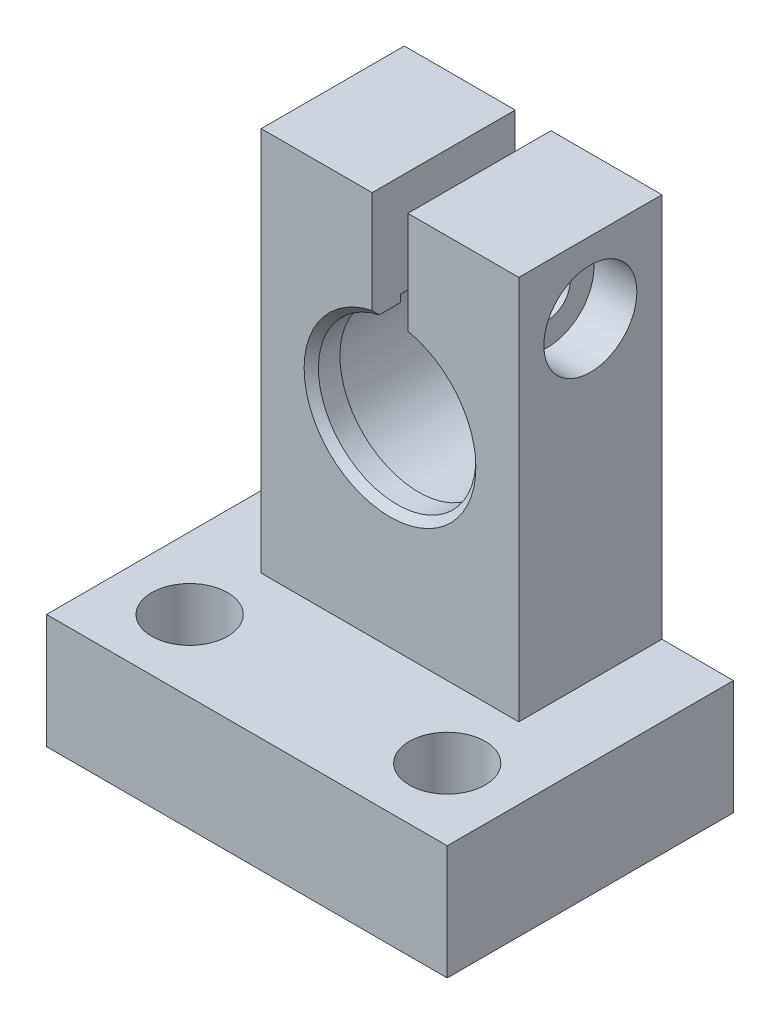
ISO-10303-21;
HEADER;
FILE_DESCRIPTION(('STEP AP214'),'2;1');
FILE_NAME('part.step','',(''),(''),'','','');
FILE_SCHEMA(('AUTOMOTIVE_DESIGN { 1 0 10303 214 1 1 1 1 }'));
ENDSEC;
DATA;
#1=APPLICATION_CONTEXT('core data for automotive mechanical design processes');
#2=APPLICATION_PROTOCOL_DEFINITION('international standard','automotive_design',2000,#1);
#3=PRODUCT_CONTEXT('',#1,'mechanical');
#4=PRODUCT('Part','Part','',(#3));
#5=PRODUCT_RELATED_PRODUCT_CATEGORY('part','',(#4));
#6=PRODUCT_DEFINITION_FORMATION('','',#4);
#7=PRODUCT_DEFINITION_CONTEXT('part definition',#1,'design');
#8=PRODUCT_DEFINITION('design','',#6,#7);
#9=PRODUCT_DEFINITION_SHAPE('','',#8);
#10=(LENGTH_UNIT() NAMED_UNIT(*) SI_UNIT(.MILLI.,.METRE.));
#11=(NAMED_UNIT(*) PLANE_ANGLE_UNIT() SI_UNIT($,.RADIAN.));
#12=(NAMED_UNIT(*) SI_UNIT($,.STERADIAN.) SOLID_ANGLE_UNIT());
#13=UNCERTAINTY_MEASURE_WITH_UNIT(LENGTH_MEASURE(1.E-05),#10,'distance_accuracy_value','');
#14=(GEOMETRIC_REPRESENTATION_CONTEXT(3) GLOBAL_UNCERTAINTY_ASSIGNED_CONTEXT((#13)) GLOBAL_UNIT_ASSIGNED_CONTEXT((#10,
#11,#12)) REPRESENTATION_CONTEXT('',''));
#15=CARTESIAN_POINT('',(0.,0.,0.));
#16=DIRECTION('',(0.,0.,1.));
#17=DIRECTION('',(1.,0.,0.));
#18=AXIS2_PLACEMENT_3D('',#15,#16,#17);
#19=CARTESIAN_POINT('',(-14.,-13.9,0.));
#20=DIRECTION('',(0.,-1.,0.));
#21=DIRECTION('',(0.,0.,-1.));
#22=AXIS2_PLACEMENT_3D('',#19,#20,#21);
#23=PLANE('',#22);
#24=DIRECTION('',(0.,0.,-1.));
#25=VECTOR('',#24,1.);
#26=CARTESIAN_POINT('',(-9.,-13.9,0.));
#27=LINE('',#26,#25);
#28=CARTESIAN_POINT('',(-9.,-13.9,10.));
#29=VERTEX_POINT('',#28);
#30=CARTESIAN_POINT('',(-9.,-13.9,0.));
#31=VERTEX_POINT('',#30);
#32=EDGE_CURVE('E188',#29,#31,#27,.T.);
#33=ORIENTED_EDGE('',*,*,#32,.T.);
#34=DIRECTION('',(1.,0.,0.));
#35=VECTOR('',#34,1.);
#36=CARTESIAN_POINT('',(-14.,-13.9,0.));
#37=LINE('',#36,#35);
#38=CARTESIAN_POINT('',(-14.,-13.9,0.));
#39=VERTEX_POINT('',#38);
#40=EDGE_CURVE('E196',#39,#31,#37,.T.);
#41=ORIENTED_EDGE('',*,*,#40,.F.);
#42=DIRECTION('',(0.,0.,-1.));
#43=VECTOR('',#42,1.);
#44=CARTESIAN_POINT('',(-14.,-13.9,0.));
#45=LINE('',#44,#43);
#46=CARTESIAN_POINT('',(-14.,-13.9,20.));
#47=VERTEX_POINT('',#46);
#48=EDGE_CURVE('E194',#47,#39,#45,.T.);
#49=ORIENTED_EDGE('',*,*,#48,.F.);
#50=DIRECTION('',(1.,0.,0.));
#51=VECTOR('',#50,1.);
#52=CARTESIAN_POINT('',(-14.,-13.9,20.));
#53=LINE('',#52,#51);
#54=CARTESIAN_POINT('',(14.,-13.9,20.));
#55=VERTEX_POINT('',#54);
#56=EDGE_CURVE('E180',#47,#55,#53,.T.);
#57=ORIENTED_EDGE('',*,*,#56,.T.);
#58=DIRECTION('',(0.,0.,-1.));
#59=VECTOR('',#58,1.);
#60=CARTESIAN_POINT('',(14.,-13.9,0.));
#61=LINE('',#60,#59);
#62=CARTESIAN_POINT('',(14.,-13.9,0.));
#63=VERTEX_POINT('',#62);
#64=EDGE_CURVE('E160',#55,#63,#61,.T.);
#65=ORIENTED_EDGE('',*,*,#64,.T.);
#66=DIRECTION('',(-1.,0.,0.));
#67=VECTOR('',#66,1.);
#68=CARTESIAN_POINT('',(14.,-13.9,0.));
#69=LINE('',#68,#67);
#70=CARTESIAN_POINT('',(9.,-13.9,0.));
#71=VERTEX_POINT('',#70);
#72=EDGE_CURVE('E54',#63,#71,#69,.T.);
#73=ORIENTED_EDGE('',*,*,#72,.T.);
#74=DIRECTION('',(0.,0.,-1.));
#75=VECTOR('',#74,1.);
#76=CARTESIAN_POINT('',(9.,-13.9,0.));
#77=LINE('',#76,#75);
#78=CARTESIAN_POINT('',(9.,-13.9,10.));
#79=VERTEX_POINT('',#78);
#80=EDGE_CURVE('E184',#79,#71,#77,.T.);
#81=ORIENTED_EDGE('',*,*,#80,.F.);
#82=DIRECTION('',(-1.,0.,0.));
#83=VECTOR('',#82,1.);
#84=CARTESIAN_POINT('',(-14.,-13.9,10.));
#85=LINE('',#84,#83);
#86=EDGE_CURVE('E11',#79,#29,#85,.T.);
#87=ORIENTED_EDGE('',*,*,#86,.T.);
#88=EDGE_LOOP('',(#33,#41,#49,#57,#65,#73,#81,#87));
#89=FACE_BOUND('',#88,.T.);
#90=CARTESIAN_POINT('',(9.00000000000001,-13.9,15.));
#91=DIRECTION('',(0.,1.,0.));
#92=DIRECTION('',(0.,0.,1.));
#93=AXIS2_PLACEMENT_3D('',#90,#91,#92);
#94=CIRCLE('',#93,2.65);
#95=CARTESIAN_POINT('',(9.00000000000001,-13.9,17.65));
#96=VERTEX_POINT('',#95);
#97=EDGE_CURVE('E176',#96,#96,#94,.T.);
#98=ORIENTED_EDGE('',*,*,#97,.F.);
#99=EDGE_LOOP('',(#98));
#100=FACE_BOUND('',#99,.T.);
#101=CARTESIAN_POINT('',(-9.00000000000001,-13.9,15.));
#102=DIRECTION('',(0.,1.,0.));
#103=DIRECTION('',(0.,0.,1.));
#104=AXIS2_PLACEMENT_3D('',#101,#102,#103);
#105=CIRCLE('',#104,2.65);
#106=CARTESIAN_POINT('',(-9.00000000000001,-13.9,17.65));
#107=VERTEX_POINT('',#106);
#108=EDGE_CURVE('E628',#107,#107,#105,.T.);
#109=ORIENTED_EDGE('',*,*,#108,.F.);
#110=EDGE_LOOP('',(#109));
#111=FACE_BOUND('',#110,.T.);
#112=ADVANCED_FACE('F36',(#89,#100,#111),#23,.F.);
#113=CARTESIAN_POINT('',(-9.,-21.9,10.));
#114=DIRECTION('',(1.,0.,0.));
#115=DIRECTION('',(0.,0.,-1.));
#116=AXIS2_PLACEMENT_3D('',#113,#114,#115);
#117=PLANE('',#116);
#118=CARTESIAN_POINT('',(-9.,7.99999999999999,5.));
#119=DIRECTION('',(-1.,0.,0.));
#120=DIRECTION('',(0.,0.,1.));
#121=AXIS2_PLACEMENT_3D('',#118,#119,#120);
#122=CIRCLE('',#121,1.25);
#123=CARTESIAN_POINT('',(-9.,7.99999999999999,6.25));
#124=VERTEX_POINT('',#123);
#125=EDGE_CURVE('E200',#124,#124,#122,.T.);
#126=ORIENTED_EDGE('',*,*,#125,.F.);
#127=EDGE_LOOP('',(#126));
#128=FACE_BOUND('',#127,.T.);
#129=ORIENTED_EDGE('',*,*,#32,.F.);
#130=DIRECTION('',(0.,-1.,0.));
#131=VECTOR('',#130,1.);
#132=CARTESIAN_POINT('',(-9.,-21.9,10.));
#133=LINE('',#132,#131);
#134=CARTESIAN_POINT('',(-9.,13.,10.));
#135=VERTEX_POINT('',#134);
#136=EDGE_CURVE('E246',#135,#29,#133,.T.);
#137=ORIENTED_EDGE('',*,*,#136,.F.);
#138=DIRECTION('',(0.,0.,-1.));
#139=VECTOR('',#138,1.);
#140=CARTESIAN_POINT('',(-9.,13.,10.));
#141=LINE('',#140,#139);
#142=CARTESIAN_POINT('',(-9.,13.,0.));
#143=VERTEX_POINT('',#142);
#144=EDGE_CURVE('E256',#135,#143,#141,.T.);
#145=ORIENTED_EDGE('',*,*,#144,.T.);
#146=DIRECTION('',(0.,-1.,0.));
#147=VECTOR('',#146,1.);
#148=CARTESIAN_POINT('',(-9.,-21.9,0.));
#149=LINE('',#148,#147);
#150=EDGE_CURVE('E245',#143,#31,#149,.T.);
#151=ORIENTED_EDGE('',*,*,#150,.T.);
#152=EDGE_LOOP('',(#129,#137,#145,#151));
#153=FACE_BOUND('',#152,.T.);
#154=ADVANCED_FACE('F332',(#128,#153),#117,.F.);
#155=CARTESIAN_POINT('',(9.,-21.9,10.));
#156=DIRECTION('',(-1.,0.,0.));
#157=DIRECTION('',(0.,0.,1.));
#158=AXIS2_PLACEMENT_3D('',#155,#156,#157);
#159=PLANE('',#158);
#160=DIRECTION('',(0.,1.,0.));
#161=VECTOR('',#160,1.);
#162=CARTESIAN_POINT('',(9.,-21.9,10.));
#163=LINE('',#162,#161);
#164=CARTESIAN_POINT('',(9.,13.,10.));
#165=VERTEX_POINT('',#164);
#166=EDGE_CURVE('E249',#79,#165,#163,.T.);
#167=ORIENTED_EDGE('',*,*,#166,.F.);
#168=ORIENTED_EDGE('',*,*,#80,.T.);
#169=DIRECTION('',(0.,1.,0.));
#170=VECTOR('',#169,1.);
#171=CARTESIAN_POINT('',(9.,-21.9,0.));
#172=LINE('',#171,#170);
#173=CARTESIAN_POINT('',(9.,13.,0.));
#174=VERTEX_POINT('',#173);
#175=EDGE_CURVE('E259',#71,#174,#172,.T.);
#176=ORIENTED_EDGE('',*,*,#175,.T.);
#177=DIRECTION('',(0.,0.,-1.));
#178=VECTOR('',#177,1.);
#179=CARTESIAN_POINT('',(9.,13.,10.));
#180=LINE('',#179,#178);
#181=EDGE_CURVE('E266',#165,#174,#180,.T.);
#182=ORIENTED_EDGE('',*,*,#181,.F.);
#183=EDGE_LOOP('',(#167,#168,#176,#182));
#184=FACE_BOUND('',#183,.T.);
#185=CARTESIAN_POINT('',(9.,8.,5.));
#186=DIRECTION('',(1.,0.,0.));
#187=DIRECTION('',(0.,0.,-1.));
#188=AXIS2_PLACEMENT_3D('',#185,#186,#187);
#189=CIRCLE('',#188,3.25);
#190=CARTESIAN_POINT('',(9.,8.,1.75));
#191=VERTEX_POINT('',#190);
#192=EDGE_CURVE('E206',#191,#191,#189,.T.);
#193=ORIENTED_EDGE('',*,*,#192,.F.);
#194=EDGE_LOOP('',(#193));
#195=FACE_BOUND('',#194,.T.);
#196=ADVANCED_FACE('F336',(#184,#195),#159,.F.);
#197=CARTESIAN_POINT('',(9.,13.,10.));
#198=DIRECTION('',(0.,-1.,0.));
#199=DIRECTION('',(1.,0.,0.));
#200=AXIS2_PLACEMENT_3D('',#197,#198,#199);
#201=PLANE('',#200);
#202=DIRECTION('',(-1.,0.,0.));
#203=VECTOR('',#202,1.);
#204=CARTESIAN_POINT('',(9.,13.,10.));
#205=LINE('',#204,#203);
#206=CARTESIAN_POINT('',(-1.25,13.,10.));
#207=VERTEX_POINT('',#206);
#208=EDGE_CURVE('E252',#207,#135,#205,.T.);
#209=ORIENTED_EDGE('',*,*,#208,.F.);
#210=DIRECTION('',(0.,0.,1.));
#211=VECTOR('',#210,1.);
#212=CARTESIAN_POINT('',(-1.25,13.,0.));
#213=LINE('',#212,#211);
#214=CARTESIAN_POINT('',(-1.25,13.,0.));
#215=VERTEX_POINT('',#214);
#216=EDGE_CURVE('E229',#215,#207,#213,.T.);
#217=ORIENTED_EDGE('',*,*,#216,.F.);
#218=DIRECTION('',(-1.,0.,0.));
#219=VECTOR('',#218,1.);
#220=CARTESIAN_POINT('',(9.,13.,0.));
#221=LINE('',#220,#219);
#222=EDGE_CURVE('E261',#215,#143,#221,.T.);
#223=ORIENTED_EDGE('',*,*,#222,.T.);
#224=ORIENTED_EDGE('',*,*,#144,.F.);
#225=EDGE_LOOP('',(#209,#217,#223,#224));
#226=FACE_BOUND('',#225,.T.);
#227=ADVANCED_FACE('F345',(#226),#201,.F.);
#228=CARTESIAN_POINT('',(0.,0.,10.));
#229=DIRECTION('',(0.,0.,1.));
#230=DIRECTION('',(1.,0.,0.));
#231=AXIS2_PLACEMENT_3D('',#228,#229,#230);
#232=PLANE('',#231);
#233=ORIENTED_EDGE('',*,*,#86,.F.);
#234=ORIENTED_EDGE('',*,*,#166,.T.);
#235=CARTESIAN_POINT('',(1.25,13.,10.));
#236=VERTEX_POINT('',#235);
#237=EDGE_CURVE('E253',#165,#236,#205,.T.);
#238=ORIENTED_EDGE('',*,*,#237,.T.);
#239=DIRECTION('',(0.,1.,0.));
#240=VECTOR('',#239,1.);
#241=CARTESIAN_POINT('',(1.25,5.35607132140714,10.));
#242=LINE('',#241,#240);
#243=CARTESIAN_POINT('',(1.25,5.86834729715275,10.));
#244=VERTEX_POINT('',#243);
#245=EDGE_CURVE('E223',#244,#236,#242,.T.);
#246=ORIENTED_EDGE('',*,*,#245,.F.);
#247=CARTESIAN_POINT('',(0.,0.,10.));
#248=DIRECTION('',(0.,0.,1.));
#249=DIRECTION('',(1.,0.,0.));
#250=AXIS2_PLACEMENT_3D('',#247,#248,#249);
#251=CIRCLE('',#250,6.);
#252=CARTESIAN_POINT('',(-1.25,5.86834729715275,10.));
#253=VERTEX_POINT('',#252);
#254=EDGE_CURVE('E322',#244,#253,#251,.F.);
#255=ORIENTED_EDGE('',*,*,#254,.T.);
#256=DIRECTION('',(0.,-1.,0.));
#257=VECTOR('',#256,1.);
#258=CARTESIAN_POINT('',(-1.25,5.35607132140714,10.));
#259=LINE('',#258,#257);
#260=EDGE_CURVE('E218',#207,#253,#259,.T.);
#261=ORIENTED_EDGE('',*,*,#260,.F.);
#262=ORIENTED_EDGE('',*,*,#208,.T.);
#263=ORIENTED_EDGE('',*,*,#136,.T.);
#264=EDGE_LOOP('',(#233,#234,#238,#246,#255,#261,#262,#263));
#265=FACE_BOUND('',#264,.T.);
#266=ADVANCED_FACE('F353',(#265),#232,.T.);
#267=CARTESIAN_POINT('',(0.,0.,0.));
#268=DIRECTION('',(0.,0.,1.));
#269=DIRECTION('',(1.,0.,0.));
#270=AXIS2_PLACEMENT_3D('',#267,#268,#269);
#271=PLANE('',#270);
#272=DIRECTION('',(0.,-1.,0.));
#273=VECTOR('',#272,1.);
#274=CARTESIAN_POINT('',(-1.25,5.35607132140714,0.));
#275=LINE('',#274,#273);
#276=CARTESIAN_POINT('',(-1.25,6.37867541108654,0.));
#277=VERTEX_POINT('',#276);
#278=EDGE_CURVE('E219',#215,#277,#275,.T.);
#279=ORIENTED_EDGE('',*,*,#278,.T.);
#280=CARTESIAN_POINT('',(0.,0.,0.));
#281=DIRECTION('',(0.,0.,1.));
#282=DIRECTION('',(1.,0.,0.));
#283=AXIS2_PLACEMENT_3D('',#280,#281,#282);
#284=CIRCLE('',#283,6.5);
#285=CARTESIAN_POINT('',(1.25,6.37867541108654,0.));
#286=VERTEX_POINT('',#285);
#287=EDGE_CURVE('E277',#277,#286,#284,.T.);
#288=ORIENTED_EDGE('',*,*,#287,.T.);
#289=DIRECTION('',(0.,1.,0.));
#290=VECTOR('',#289,1.);
#291=CARTESIAN_POINT('',(1.25,5.35607132140714,0.));
#292=LINE('',#291,#290);
#293=CARTESIAN_POINT('',(1.25,13.,0.));
#294=VERTEX_POINT('',#293);
#295=EDGE_CURVE('E222',#286,#294,#292,.T.);
#296=ORIENTED_EDGE('',*,*,#295,.T.);
#297=EDGE_CURVE('E250',#174,#294,#221,.T.);
#298=ORIENTED_EDGE('',*,*,#297,.F.);
#299=ORIENTED_EDGE('',*,*,#175,.F.);
#300=ORIENTED_EDGE('',*,*,#72,.F.);
#301=DIRECTION('',(0.,-1.,0.));
#302=VECTOR('',#301,1.);
#303=CARTESIAN_POINT('',(14.,-21.9,0.));
#304=LINE('',#303,#302);
#305=CARTESIAN_POINT('',(14.,-21.9,0.));
#306=VERTEX_POINT('',#305);
#307=EDGE_CURVE('E182',#63,#306,#304,.T.);
#308=ORIENTED_EDGE('',*,*,#307,.T.);
#309=DIRECTION('',(1.,0.,0.));
#310=VECTOR('',#309,1.);
#311=CARTESIAN_POINT('',(9.,-21.9,0.));
#312=LINE('',#311,#310);
#313=CARTESIAN_POINT('',(-14.,-21.9,0.));
#314=VERTEX_POINT('',#313);
#315=EDGE_CURVE('E156',#314,#306,#312,.T.);
#316=ORIENTED_EDGE('',*,*,#315,.F.);
#317=DIRECTION('',(0.,-1.,0.));
#318=VECTOR('',#317,1.);
#319=CARTESIAN_POINT('',(-14.,-21.9,0.));
#320=LINE('',#319,#318);
#321=EDGE_CURVE('E189',#39,#314,#320,.T.);
#322=ORIENTED_EDGE('',*,*,#321,.F.);
#323=ORIENTED_EDGE('',*,*,#40,.T.);
#324=ORIENTED_EDGE('',*,*,#150,.F.);
#325=ORIENTED_EDGE('',*,*,#222,.F.);
#326=EDGE_LOOP('',(#279,#288,#296,#298,#299,#300,#308,#316,#322,#323,#324,#325));
#327=FACE_BOUND('',#326,.T.);
#328=ADVANCED_FACE('F341',(#327),#271,.F.);
#329=CARTESIAN_POINT('',(9.,-21.9,10.));
#330=DIRECTION('',(0.,1.,0.));
#331=DIRECTION('',(-1.,0.,0.));
#332=AXIS2_PLACEMENT_3D('',#329,#330,#331);
#333=PLANE('',#332);
#334=CARTESIAN_POINT('',(-9.00000000000001,-21.9,15.));
#335=DIRECTION('',(0.,1.,0.));
#336=DIRECTION('',(-1.,0.,0.));
#337=AXIS2_PLACEMENT_3D('',#334,#335,#336);
#338=CIRCLE('',#337,2.65);
#339=CARTESIAN_POINT('',(-11.65,-21.9,15.));
#340=VERTEX_POINT('',#339);
#341=EDGE_CURVE('E625',#340,#340,#338,.T.);
#342=ORIENTED_EDGE('',*,*,#341,.T.);
#343=EDGE_LOOP('',(#342));
#344=FACE_BOUND('',#343,.T.);
#345=CARTESIAN_POINT('',(9.00000000000001,-21.9,15.));
#346=DIRECTION('',(0.,1.,0.));
#347=DIRECTION('',(-1.,0.,0.));
#348=AXIS2_PLACEMENT_3D('',#345,#346,#347);
#349=CIRCLE('',#348,2.65);
#350=CARTESIAN_POINT('',(6.35000000000001,-21.9,15.));
#351=VERTEX_POINT('',#350);
#352=EDGE_CURVE('E173',#351,#351,#349,.T.);
#353=ORIENTED_EDGE('',*,*,#352,.T.);
#354=EDGE_LOOP('',(#353));
#355=FACE_BOUND('',#354,.T.);
#356=ORIENTED_EDGE('',*,*,#315,.T.);
#357=DIRECTION('',(0.,0.,1.));
#358=VECTOR('',#357,1.);
#359=CARTESIAN_POINT('',(14.,-21.9,0.));
#360=LINE('',#359,#358);
#361=CARTESIAN_POINT('',(14.,-21.9,20.));
#362=VERTEX_POINT('',#361);
#363=EDGE_CURVE('E150',#306,#362,#360,.T.);
#364=ORIENTED_EDGE('',*,*,#363,.T.);
#365=DIRECTION('',(-1.,0.,0.));
#366=VECTOR('',#365,1.);
#367=CARTESIAN_POINT('',(-14.,-21.9,20.));
#368=LINE('',#367,#366);
#369=CARTESIAN_POINT('',(-14.,-21.9,20.));
#370=VERTEX_POINT('',#369);
#371=EDGE_CURVE('E155',#362,#370,#368,.T.);
#372=ORIENTED_EDGE('',*,*,#371,.T.);
#373=DIRECTION('',(0.,0.,1.));
#374=VECTOR('',#373,1.);
#375=CARTESIAN_POINT('',(-14.,-21.9,0.));
#376=LINE('',#375,#374);
#377=EDGE_CURVE('E192',#314,#370,#376,.T.);
#378=ORIENTED_EDGE('',*,*,#377,.F.);
#379=EDGE_LOOP('',(#356,#364,#372,#378));
#380=FACE_BOUND('',#379,.T.);
#381=ADVANCED_FACE('F152',(#344,#355,#380),#333,.F.);
#382=ORIENTED_EDGE('',*,*,#297,.T.);
#383=DIRECTION('',(0.,0.,1.));
#384=VECTOR('',#383,1.);
#385=CARTESIAN_POINT('',(1.25,13.,0.));
#386=LINE('',#385,#384);
#387=EDGE_CURVE('E225',#294,#236,#386,.T.);
#388=ORIENTED_EDGE('',*,*,#387,.T.);
#389=ORIENTED_EDGE('',*,*,#237,.F.);
#390=ORIENTED_EDGE('',*,*,#181,.T.);
#391=EDGE_LOOP('',(#382,#388,#389,#390));
#392=FACE_BOUND('',#391,.T.);
#393=ADVANCED_FACE('F340',(#392),#201,.F.);
#394=CARTESIAN_POINT('',(0.,0.,10.));
#395=DIRECTION('',(0.,0.,-1.));
#396=DIRECTION('',(-1.,0.,0.));
#397=AXIS2_PLACEMENT_3D('',#394,#395,#396);
#398=CYLINDRICAL_SURFACE('',#397,6.);
#399=DIRECTION('',(0.,0.,-1.));
#400=VECTOR('',#399,1.);
#401=CARTESIAN_POINT('',(1.25,5.86834729715275,10.));
#402=LINE('',#401,#400);
#403=CARTESIAN_POINT('',(1.25,5.86834729715275,0.500000000000002));
#404=VERTEX_POINT('',#403);
#405=CARTESIAN_POINT('',(1.25,5.86834729715275,8.));
#406=VERTEX_POINT('',#405);
#407=EDGE_CURVE('E235',#404,#406,#402,.F.);
#408=ORIENTED_EDGE('',*,*,#407,.F.);
#409=CARTESIAN_POINT('',(0.,0.,0.500000000000002));
#410=DIRECTION('',(0.,0.,1.));
#411=DIRECTION('',(1.,0.,0.));
#412=AXIS2_PLACEMENT_3D('',#409,#410,#411);
#413=CIRCLE('',#412,6.);
#414=CARTESIAN_POINT('',(-1.25,5.86834729715275,0.500000000000002));
#415=VERTEX_POINT('',#414);
#416=EDGE_CURVE('E410',#404,#415,#413,.F.);
#417=ORIENTED_EDGE('',*,*,#416,.T.);
#418=DIRECTION('',(0.,0.,-1.));
#419=VECTOR('',#418,1.);
#420=CARTESIAN_POINT('',(-1.25,5.86834729715275,10.));
#421=LINE('',#420,#419);
#422=CARTESIAN_POINT('',(-1.25,5.86834729715275,8.));
#423=VERTEX_POINT('',#422);
#424=EDGE_CURVE('E239',#423,#415,#421,.T.);
#425=ORIENTED_EDGE('',*,*,#424,.F.);
#426=CARTESIAN_POINT('',(0.,0.,8.));
#427=DIRECTION('',(0.,0.,-1.));
#428=DIRECTION('',(-1.,0.,0.));
#429=AXIS2_PLACEMENT_3D('',#426,#427,#428);
#430=CIRCLE('',#429,6.);
#431=EDGE_CURVE('E269',#406,#423,#430,.T.);
#432=ORIENTED_EDGE('',*,*,#431,.F.);
#433=EDGE_LOOP('',(#408,#417,#425,#432));
#434=FACE_BOUND('',#433,.T.);
#435=ADVANCED_FACE('F349',(#434),#398,.F.);
#436=CARTESIAN_POINT('',(0.,0.,8.));
#437=DIRECTION('',(0.,0.,-1.));
#438=DIRECTION('',(-1.,0.,0.));
#439=AXIS2_PLACEMENT_3D('',#436,#437,#438);
#440=PLANE('',#439);
#441=DIRECTION('',(0.,1.,0.));
#442=VECTOR('',#441,1.);
#443=CARTESIAN_POINT('',(-1.25,0.,8.));
#444=LINE('',#443,#442);
#445=CARTESIAN_POINT('',(-1.25,5.35607132140714,8.));
#446=VERTEX_POINT('',#445);
#447=EDGE_CURVE('E237',#446,#423,#444,.T.);
#448=ORIENTED_EDGE('',*,*,#447,.F.);
#449=CARTESIAN_POINT('',(0.,0.,8.));
#450=DIRECTION('',(0.,0.,-1.));
#451=DIRECTION('',(-1.,0.,0.));
#452=AXIS2_PLACEMENT_3D('',#449,#450,#451);
#453=CIRCLE('',#452,5.5);
#454=CARTESIAN_POINT('',(1.25,5.35607132140714,8.));
#455=VERTEX_POINT('',#454);
#456=EDGE_CURVE('E242',#455,#446,#453,.T.);
#457=ORIENTED_EDGE('',*,*,#456,.F.);
#458=DIRECTION('',(0.,-1.,0.));
#459=VECTOR('',#458,1.);
#460=CARTESIAN_POINT('',(1.25,0.,8.));
#461=LINE('',#460,#459);
#462=EDGE_CURVE('E231',#406,#455,#461,.T.);
#463=ORIENTED_EDGE('',*,*,#462,.F.);
#464=ORIENTED_EDGE('',*,*,#431,.T.);
#465=EDGE_LOOP('',(#448,#457,#463,#464));
#466=FACE_BOUND('',#465,.T.);
#467=ADVANCED_FACE('F359',(#466),#440,.T.);
#468=CARTESIAN_POINT('',(0.,0.,8.));
#469=DIRECTION('',(0.,0.,1.));
#470=DIRECTION('',(1.,0.,0.));
#471=AXIS2_PLACEMENT_3D('',#468,#469,#470);
#472=CYLINDRICAL_SURFACE('',#471,5.5);
#473=DIRECTION('',(0.,0.,1.));
#474=VECTOR('',#473,1.);
#475=CARTESIAN_POINT('',(-1.25,5.35607132140714,8.));
#476=LINE('',#475,#474);
#477=CARTESIAN_POINT('',(-1.25,5.35607132140714,9.5));
#478=VERTEX_POINT('',#477);
#479=EDGE_CURVE('E272',#478,#446,#476,.F.);
#480=ORIENTED_EDGE('',*,*,#479,.F.);
#481=CARTESIAN_POINT('',(0.,0.,9.5));
#482=DIRECTION('',(0.,0.,1.));
#483=DIRECTION('',(1.,0.,0.));
#484=AXIS2_PLACEMENT_3D('',#481,#482,#483);
#485=CIRCLE('',#484,5.5);
#486=CARTESIAN_POINT('',(1.25,5.35607132140714,9.5));
#487=VERTEX_POINT('',#486);
#488=EDGE_CURVE('E42',#478,#487,#485,.T.);
#489=ORIENTED_EDGE('',*,*,#488,.T.);
#490=DIRECTION('',(0.,0.,1.));
#491=VECTOR('',#490,1.);
#492=CARTESIAN_POINT('',(1.25,5.35607132140714,8.));
#493=LINE('',#492,#491);
#494=EDGE_CURVE('E274',#455,#487,#493,.T.);
#495=ORIENTED_EDGE('',*,*,#494,.F.);
#496=ORIENTED_EDGE('',*,*,#456,.T.);
#497=EDGE_LOOP('',(#480,#489,#495,#496));
#498=FACE_BOUND('',#497,.T.);
#499=ADVANCED_FACE('F306',(#498),#472,.F.);
#500=CARTESIAN_POINT('',(-1.25,5.35607132140714,0.));
#501=DIRECTION('',(-1.,0.,0.));
#502=DIRECTION('',(0.,-1.,0.));
#503=AXIS2_PLACEMENT_3D('',#500,#501,#502);
#504=PLANE('',#503);
#505=CARTESIAN_POINT('',(-1.25,7.99999999999999,5.));
#506=DIRECTION('',(-1.,0.,0.));
#507=DIRECTION('',(0.,-1.,0.));
#508=AXIS2_PLACEMENT_3D('',#505,#506,#507);
#509=CIRCLE('',#508,1.25);
#510=CARTESIAN_POINT('',(-1.25,6.75,5.));
#511=VERTEX_POINT('',#510);
#512=EDGE_CURVE('E203',#511,#511,#509,.T.);
#513=ORIENTED_EDGE('',*,*,#512,.T.);
#514=EDGE_LOOP('',(#513));
#515=FACE_BOUND('',#514,.T.);
#516=ORIENTED_EDGE('',*,*,#424,.T.);
#517=CARTESIAN_POINT('',(-1.25,5.86834729715275,0.500000000000002));
#518=CARTESIAN_POINT('',(-1.25,5.95347153411322,0.416737653453886));
#519=CARTESIAN_POINT('',(-1.25,6.03856099571727,0.333439813223666));
#520=CARTESIAN_POINT('',(-1.25,6.20867036702756,0.16677314655601));
#521=CARTESIAN_POINT('',(-1.25,6.29369027673477,0.0834043201195626));
#522=CARTESIAN_POINT('',(-1.25,6.37867541108654,0.));
#523=B_SPLINE_CURVE_WITH_KNOTS('',3,(#517,#518,#519,#520,#521,#522),.UNSPECIFIED.,.F.,.F.,(4,2,
4),(0.,0.35722362739295,0.714447249809099),.UNSPECIFIED.);
#524=EDGE_CURVE('E317',#415,#277,#523,.T.);
#525=ORIENTED_EDGE('',*,*,#524,.T.);
#526=ORIENTED_EDGE('',*,*,#278,.F.);
#527=ORIENTED_EDGE('',*,*,#216,.T.);
#528=ORIENTED_EDGE('',*,*,#260,.T.);
#529=CARTESIAN_POINT('',(-1.25,5.86834729715275,10.));
#530=CARTESIAN_POINT('',(-1.25,5.7830579908845,9.91657443556982));
#531=CARTESIAN_POINT('',(-1.25,5.697723673647,9.83319498721601));
#532=CARTESIAN_POINT('',(-1.25,5.52696501506741,9.66652832054701));
#533=CARTESIAN_POINT('',(-1.25,5.44154067372304,9.58324110223414));
#534=CARTESIAN_POINT('',(-1.25,5.35607132140714,9.5));
#535=B_SPLINE_CURVE_WITH_KNOTS('',3,(#529,#530,#531,#532,#533,#534),.UNSPECIFIED.,.F.,.F.,(4,2,
4),(0.,0.35791996724907,0.715839943578595),.UNSPECIFIED.);
#536=EDGE_CURVE('E311',#253,#478,#535,.T.);
#537=ORIENTED_EDGE('',*,*,#536,.T.);
#538=ORIENTED_EDGE('',*,*,#479,.T.);
#539=ORIENTED_EDGE('',*,*,#447,.T.);
#540=EDGE_LOOP('',(#516,#525,#526,#527,#528,#537,#538,#539));
#541=FACE_BOUND('',#540,.T.);
#542=ADVANCED_FACE('F299',(#515,#541),#504,.F.);
#543=CARTESIAN_POINT('',(1.25,5.35607132140714,0.));
#544=DIRECTION('',(1.,0.,0.));
#545=DIRECTION('',(0.,1.,0.));
#546=AXIS2_PLACEMENT_3D('',#543,#544,#545);
#547=PLANE('',#546);
#548=CARTESIAN_POINT('',(1.25,8.,5.));
#549=DIRECTION('',(1.,0.,0.));
#550=DIRECTION('',(0.,1.,0.));
#551=AXIS2_PLACEMENT_3D('',#548,#549,#550);
#552=CIRCLE('',#551,1.6);
#553=CARTESIAN_POINT('',(1.25,9.6,5.));
#554=VERTEX_POINT('',#553);
#555=EDGE_CURVE('E215',#554,#554,#552,.T.);
#556=ORIENTED_EDGE('',*,*,#555,.T.);
#557=EDGE_LOOP('',(#556));
#558=FACE_BOUND('',#557,.T.);
#559=ORIENTED_EDGE('',*,*,#295,.F.);
#560=CARTESIAN_POINT('',(1.25,6.37867541108654,0.));
#561=CARTESIAN_POINT('',(1.25,6.29369027673477,0.0834043201195624));
#562=CARTESIAN_POINT('',(1.25,6.20867036702756,0.16677314655601));
#563=CARTESIAN_POINT('',(1.25,6.03856099571727,0.333439813223666));
#564=CARTESIAN_POINT('',(1.25,5.95347153411322,0.416737653453886));
#565=CARTESIAN_POINT('',(1.25,5.86834729715275,0.500000000000002));
#566=B_SPLINE_CURVE_WITH_KNOTS('',3,(#560,#561,#562,#563,#564,#565),.UNSPECIFIED.,.F.,.F.,(4,2,
4),(0.,0.357223622416149,0.714447249809099),.UNSPECIFIED.);
#567=EDGE_CURVE('E287',#286,#404,#566,.T.);
#568=ORIENTED_EDGE('',*,*,#567,.T.);
#569=ORIENTED_EDGE('',*,*,#407,.T.);
#570=ORIENTED_EDGE('',*,*,#462,.T.);
#571=ORIENTED_EDGE('',*,*,#494,.T.);
#572=CARTESIAN_POINT('',(1.25,5.35607132140714,9.5));
#573=CARTESIAN_POINT('',(1.25,5.44154067372304,9.58324110223414));
#574=CARTESIAN_POINT('',(1.25,5.52696501506741,9.66652832054701));
#575=CARTESIAN_POINT('',(1.25,5.697723673647,9.83319498721601));
#576=CARTESIAN_POINT('',(1.25,5.7830579908845,9.91657443556982));
#577=CARTESIAN_POINT('',(1.25,5.86834729715275,10.));
#578=B_SPLINE_CURVE_WITH_KNOTS('',3,(#572,#573,#574,#575,#576,#577),.UNSPECIFIED.,.F.,.F.,(4,2,
4),(0.,0.357919976329524,0.715839943578595),.UNSPECIFIED.);
#579=EDGE_CURVE('E280',#487,#244,#578,.T.);
#580=ORIENTED_EDGE('',*,*,#579,.T.);
#581=ORIENTED_EDGE('',*,*,#245,.T.);
#582=ORIENTED_EDGE('',*,*,#387,.F.);
#583=EDGE_LOOP('',(#559,#568,#569,#570,#571,#580,#581,#582));
#584=FACE_BOUND('',#583,.T.);
#585=ADVANCED_FACE('F293',(#558,#584),#547,.F.);
#586=CARTESIAN_POINT('',(9.,8.,5.));
#587=DIRECTION('',(1.,0.,0.));
#588=DIRECTION('',(0.,0.,-1.));
#589=AXIS2_PLACEMENT_3D('',#586,#587,#588);
#590=CYLINDRICAL_SURFACE('',#589,1.6);
#591=ORIENTED_EDGE('',*,*,#555,.F.);
#592=EDGE_LOOP('',(#591));
#593=FACE_BOUND('',#592,.T.);
#594=CARTESIAN_POINT('',(6.,8.,5.));
#595=DIRECTION('',(1.,0.,0.));
#596=DIRECTION('',(0.,0.,-1.));
#597=AXIS2_PLACEMENT_3D('',#594,#595,#596);
#598=CIRCLE('',#597,1.6);
#599=CARTESIAN_POINT('',(6.,8.,3.4));
#600=VERTEX_POINT('',#599);
#601=EDGE_CURVE('E212',#600,#600,#598,.T.);
#602=ORIENTED_EDGE('',*,*,#601,.T.);
#603=EDGE_LOOP('',(#602));
#604=FACE_BOUND('',#603,.T.);
#605=ADVANCED_FACE('F298',(#593,#604),#590,.F.);
#606=CARTESIAN_POINT('',(6.,9.6,5.));
#607=DIRECTION('',(-1.,0.,0.));
#608=DIRECTION('',(0.,0.,1.));
#609=AXIS2_PLACEMENT_3D('',#606,#607,#608);
#610=PLANE('',#609);
#611=ORIENTED_EDGE('',*,*,#601,.F.);
#612=EDGE_LOOP('',(#611));
#613=FACE_BOUND('',#612,.T.);
#614=CARTESIAN_POINT('',(6.,8.,5.));
#615=DIRECTION('',(1.,0.,0.));
#616=DIRECTION('',(0.,0.,-1.));
#617=AXIS2_PLACEMENT_3D('',#614,#615,#616);
#618=CIRCLE('',#617,3.25);
#619=CARTESIAN_POINT('',(6.,8.,1.75));
#620=VERTEX_POINT('',#619);
#621=EDGE_CURVE('E209',#620,#620,#618,.T.);
#622=ORIENTED_EDGE('',*,*,#621,.T.);
#623=EDGE_LOOP('',(#622));
#624=FACE_BOUND('',#623,.T.);
#625=ADVANCED_FACE('F382',(#613,#624),#610,.F.);
#626=CARTESIAN_POINT('',(9.,8.,5.));
#627=DIRECTION('',(1.,0.,0.));
#628=DIRECTION('',(0.,0.,-1.));
#629=AXIS2_PLACEMENT_3D('',#626,#627,#628);
#630=CYLINDRICAL_SURFACE('',#629,3.25);
#631=ORIENTED_EDGE('',*,*,#621,.F.);
#632=EDGE_LOOP('',(#631));
#633=FACE_BOUND('',#632,.T.);
#634=ORIENTED_EDGE('',*,*,#192,.T.);
#635=EDGE_LOOP('',(#634));
#636=FACE_BOUND('',#635,.T.);
#637=ADVANCED_FACE('F379',(#633,#636),#630,.F.);
#638=CARTESIAN_POINT('',(-9.,7.99999999999999,5.));
#639=DIRECTION('',(-1.,0.,0.));
#640=DIRECTION('',(0.,0.,1.));
#641=AXIS2_PLACEMENT_3D('',#638,#639,#640);
#642=CYLINDRICAL_SURFACE('',#641,1.25);
#643=ORIENTED_EDGE('',*,*,#512,.F.);
#644=EDGE_LOOP('',(#643));
#645=FACE_BOUND('',#644,.T.);
#646=ORIENTED_EDGE('',*,*,#125,.T.);
#647=EDGE_LOOP('',(#646));
#648=FACE_BOUND('',#647,.T.);
#649=ADVANCED_FACE('F330',(#645,#648),#642,.F.);
#650=CARTESIAN_POINT('',(0.,0.,0.));
#651=DIRECTION('',(0.,0.,-1.));
#652=DIRECTION('',(-1.,0.,0.));
#653=AXIS2_PLACEMENT_3D('',#650,#651,#652);
#654=CONICAL_SURFACE('',#653,6.5,0.785398163397444);
#655=ORIENTED_EDGE('',*,*,#524,.F.);
#656=ORIENTED_EDGE('',*,*,#416,.F.);
#657=ORIENTED_EDGE('',*,*,#567,.F.);
#658=ORIENTED_EDGE('',*,*,#287,.F.);
#659=EDGE_LOOP('',(#655,#656,#657,#658));
#660=FACE_BOUND('',#659,.T.);
#661=ADVANCED_FACE('F324',(#660),#654,.F.);
#662=CARTESIAN_POINT('',(0.,0.,10.));
#663=DIRECTION('',(0.,0.,1.));
#664=DIRECTION('',(1.,0.,0.));
#665=AXIS2_PLACEMENT_3D('',#662,#663,#664);
#666=CONICAL_SURFACE('',#665,6.,0.785398163397447);
#667=ORIENTED_EDGE('',*,*,#579,.F.);
#668=ORIENTED_EDGE('',*,*,#488,.F.);
#669=ORIENTED_EDGE('',*,*,#536,.F.);
#670=ORIENTED_EDGE('',*,*,#254,.F.);
#671=EDGE_LOOP('',(#667,#668,#669,#670));
#672=FACE_BOUND('',#671,.T.);
#673=ADVANCED_FACE('F39',(#672),#666,.F.);
#674=CARTESIAN_POINT('',(-14.,0.,0.));
#675=DIRECTION('',(1.,0.,0.));
#676=DIRECTION('',(0.,0.,-1.));
#677=AXIS2_PLACEMENT_3D('',#674,#675,#676);
#678=PLANE('',#677);
#679=ORIENTED_EDGE('',*,*,#321,.T.);
#680=ORIENTED_EDGE('',*,*,#377,.T.);
#681=DIRECTION('',(0.,-1.,0.));
#682=VECTOR('',#681,1.);
#683=CARTESIAN_POINT('',(-14.,15.832137494637,20.));
#684=LINE('',#683,#682);
#685=EDGE_CURVE('E168',#47,#370,#684,.T.);
#686=ORIENTED_EDGE('',*,*,#685,.F.);
#687=ORIENTED_EDGE('',*,*,#48,.T.);
#688=EDGE_LOOP('',(#679,#680,#686,#687));
#689=FACE_BOUND('',#688,.T.);
#690=ADVANCED_FACE('F375',(#689),#678,.F.);
#691=CARTESIAN_POINT('',(14.,0.,0.));
#692=DIRECTION('',(-1.,0.,0.));
#693=DIRECTION('',(0.,0.,-1.));
#694=AXIS2_PLACEMENT_3D('',#691,#692,#693);
#695=PLANE('',#694);
#696=ORIENTED_EDGE('',*,*,#307,.F.);
#697=ORIENTED_EDGE('',*,*,#64,.F.);
#698=DIRECTION('',(0.,-1.,0.));
#699=VECTOR('',#698,1.);
#700=CARTESIAN_POINT('',(14.,15.832137494637,20.));
#701=LINE('',#700,#699);
#702=EDGE_CURVE('E163',#55,#362,#701,.T.);
#703=ORIENTED_EDGE('',*,*,#702,.T.);
#704=ORIENTED_EDGE('',*,*,#363,.F.);
#705=EDGE_LOOP('',(#696,#697,#703,#704));
#706=FACE_BOUND('',#705,.T.);
#707=ADVANCED_FACE('F164',(#706),#695,.F.);
#708=CARTESIAN_POINT('',(-14.,15.832137494637,20.));
#709=DIRECTION('',(0.,0.,1.));
#710=DIRECTION('',(1.,0.,0.));
#711=AXIS2_PLACEMENT_3D('',#708,#709,#710);
#712=PLANE('',#711);
#713=ORIENTED_EDGE('',*,*,#56,.F.);
#714=ORIENTED_EDGE('',*,*,#685,.T.);
#715=ORIENTED_EDGE('',*,*,#371,.F.);
#716=ORIENTED_EDGE('',*,*,#702,.F.);
#717=EDGE_LOOP('',(#713,#714,#715,#716));
#718=FACE_BOUND('',#717,.T.);
#719=ADVANCED_FACE('F171',(#718),#712,.T.);
#720=CARTESIAN_POINT('',(9.00000000000001,-13.9,15.));
#721=DIRECTION('',(0.,1.,0.));
#722=DIRECTION('',(0.,0.,1.));
#723=AXIS2_PLACEMENT_3D('',#720,#721,#722);
#724=CYLINDRICAL_SURFACE('',#723,2.65);
#725=ORIENTED_EDGE('',*,*,#352,.F.);
#726=EDGE_LOOP('',(#725));
#727=FACE_BOUND('',#726,.T.);
#728=ORIENTED_EDGE('',*,*,#97,.T.);
#729=EDGE_LOOP('',(#728));
#730=FACE_BOUND('',#729,.T.);
#731=ADVANCED_FACE('F522',(#727,#730),#724,.F.);
#732=CARTESIAN_POINT('',(-9.00000000000001,-13.9,15.));
#733=DIRECTION('',(0.,1.,0.));
#734=DIRECTION('',(0.,0.,1.));
#735=AXIS2_PLACEMENT_3D('',#732,#733,#734);
#736=CYLINDRICAL_SURFACE('',#735,2.65);
#737=ORIENTED_EDGE('',*,*,#341,.F.);
#738=EDGE_LOOP('',(#737));
#739=FACE_BOUND('',#738,.T.);
#740=ORIENTED_EDGE('',*,*,#108,.T.);
#741=EDGE_LOOP('',(#740));
#742=FACE_BOUND('',#741,.T.);
#743=ADVANCED_FACE('F528',(#739,#742),#736,.F.);
#744=CLOSED_SHELL('',(#112,#154,#196,#227,#266,#328,#381,#393,#435,#467,#499,#542,#585,#605,
#625,#637,#649,#661,#673,#690,#707,#719,#731,#743));
#745=MANIFOLD_SOLID_BREP('B2',#744);
#746=ADVANCED_BREP_SHAPE_REPRESENTATION('',(#18,#745),#14);
#747=SHAPE_DEFINITION_REPRESENTATION(#9,#746);
ENDSEC;
END-ISO-10303-21;
